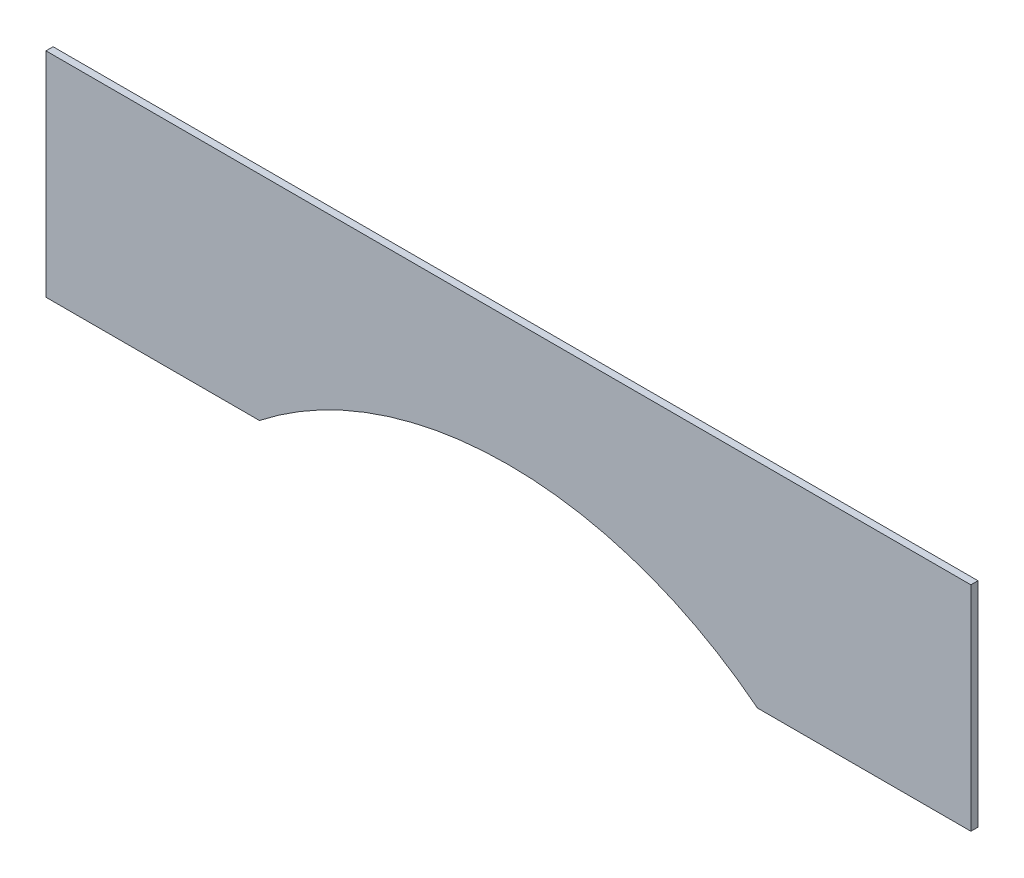
ISO-10303-21;
HEADER;
FILE_DESCRIPTION(('STEP AP214'),'2;1');
FILE_NAME('part.step','',(''),(''),'','','');
FILE_SCHEMA(('AUTOMOTIVE_DESIGN { 1 0 10303 214 1 1 1 1 }'));
ENDSEC;
DATA;
#1=APPLICATION_CONTEXT('core data for automotive mechanical design processes');
#2=APPLICATION_PROTOCOL_DEFINITION('international standard','automotive_design',2000,#1);
#3=PRODUCT_CONTEXT('',#1,'mechanical');
#4=PRODUCT('Part','Part','',(#3));
#5=PRODUCT_RELATED_PRODUCT_CATEGORY('part','',(#4));
#6=PRODUCT_DEFINITION_FORMATION('','',#4);
#7=PRODUCT_DEFINITION_CONTEXT('part definition',#1,'design');
#8=PRODUCT_DEFINITION('design','',#6,#7);
#9=PRODUCT_DEFINITION_SHAPE('','',#8);
#10=(LENGTH_UNIT() NAMED_UNIT(*) SI_UNIT(.MILLI.,.METRE.));
#11=(NAMED_UNIT(*) PLANE_ANGLE_UNIT() SI_UNIT($,.RADIAN.));
#12=(NAMED_UNIT(*) SI_UNIT($,.STERADIAN.) SOLID_ANGLE_UNIT());
#13=UNCERTAINTY_MEASURE_WITH_UNIT(LENGTH_MEASURE(1.E-05),#10,'distance_accuracy_value','');
#14=(GEOMETRIC_REPRESENTATION_CONTEXT(3) GLOBAL_UNCERTAINTY_ASSIGNED_CONTEXT((#13)) GLOBAL_UNIT_ASSIGNED_CONTEXT((#10,
#11,#12)) REPRESENTATION_CONTEXT('',''));
#15=CARTESIAN_POINT('',(0.,0.,0.));
#16=DIRECTION('',(0.,0.,1.));
#17=DIRECTION('',(1.,0.,0.));
#18=AXIS2_PLACEMENT_3D('',#15,#16,#17);
#19=CARTESIAN_POINT('',(330.2,0.,2.54));
#20=DIRECTION('',(-1.,0.,0.));
#21=DIRECTION('',(0.,0.,1.));
#22=AXIS2_PLACEMENT_3D('',#19,#20,#21);
#23=PLANE('',#22);
#24=DIRECTION('',(0.,1.,0.));
#25=VECTOR('',#24,1.);
#26=CARTESIAN_POINT('',(330.2,0.,0.));
#27=LINE('',#26,#25);
#28=CARTESIAN_POINT('',(330.2,0.,0.));
#29=VERTEX_POINT('',#28);
#30=CARTESIAN_POINT('',(330.2,76.2,0.));
#31=VERTEX_POINT('',#30);
#32=EDGE_CURVE('E126',#29,#31,#27,.T.);
#33=ORIENTED_EDGE('',*,*,#32,.T.);
#34=DIRECTION('',(0.,0.,-1.));
#35=VECTOR('',#34,1.);
#36=CARTESIAN_POINT('',(330.2,76.2,2.54));
#37=LINE('',#36,#35);
#38=CARTESIAN_POINT('',(330.2,76.2,2.54));
#39=VERTEX_POINT('',#38);
#40=EDGE_CURVE('E11',#39,#31,#37,.T.);
#41=ORIENTED_EDGE('',*,*,#40,.F.);
#42=DIRECTION('',(0.,1.,0.));
#43=VECTOR('',#42,1.);
#44=CARTESIAN_POINT('',(330.2,0.,2.54));
#45=LINE('',#44,#43);
#46=CARTESIAN_POINT('',(330.2,0.,2.54));
#47=VERTEX_POINT('',#46);
#48=EDGE_CURVE('E88',#47,#39,#45,.T.);
#49=ORIENTED_EDGE('',*,*,#48,.F.);
#50=DIRECTION('',(0.,0.,-1.));
#51=VECTOR('',#50,1.);
#52=CARTESIAN_POINT('',(330.2,0.,2.54));
#53=LINE('',#52,#51);
#54=EDGE_CURVE('E56',#47,#29,#53,.T.);
#55=ORIENTED_EDGE('',*,*,#54,.T.);
#56=EDGE_LOOP('',(#33,#41,#49,#55));
#57=FACE_BOUND('',#56,.T.);
#58=ADVANCED_FACE('F39',(#57),#23,.F.);
#59=CARTESIAN_POINT('',(0.,76.2,2.54));
#60=DIRECTION('',(0.,1.,0.));
#61=DIRECTION('',(0.,0.,1.));
#62=AXIS2_PLACEMENT_3D('',#59,#60,#61);
#63=PLANE('',#62);
#64=DIRECTION('',(1.,0.,0.));
#65=VECTOR('',#64,1.);
#66=CARTESIAN_POINT('',(0.,76.2,0.));
#67=LINE('',#66,#65);
#68=CARTESIAN_POINT('',(0.,76.2,0.));
#69=VERTEX_POINT('',#68);
#70=EDGE_CURVE('E129',#69,#31,#67,.T.);
#71=ORIENTED_EDGE('',*,*,#70,.F.);
#72=DIRECTION('',(0.,0.,-1.));
#73=VECTOR('',#72,1.);
#74=CARTESIAN_POINT('',(0.,76.2,2.54));
#75=LINE('',#74,#73);
#76=CARTESIAN_POINT('',(0.,76.2,2.54));
#77=VERTEX_POINT('',#76);
#78=EDGE_CURVE('E48',#77,#69,#75,.T.);
#79=ORIENTED_EDGE('',*,*,#78,.F.);
#80=DIRECTION('',(1.,0.,0.));
#81=VECTOR('',#80,1.);
#82=CARTESIAN_POINT('',(0.,76.2,2.54));
#83=LINE('',#82,#81);
#84=EDGE_CURVE('E175',#77,#39,#83,.T.);
#85=ORIENTED_EDGE('',*,*,#84,.T.);
#86=ORIENTED_EDGE('',*,*,#40,.T.);
#87=EDGE_LOOP('',(#71,#79,#85,#86));
#88=FACE_BOUND('',#87,.T.);
#89=ADVANCED_FACE('F158',(#88),#63,.T.);
#90=CARTESIAN_POINT('',(0.,0.,2.54));
#91=DIRECTION('',(-1.,0.,0.));
#92=DIRECTION('',(0.,0.,1.));
#93=AXIS2_PLACEMENT_3D('',#90,#91,#92);
#94=PLANE('',#93);
#95=DIRECTION('',(0.,1.,0.));
#96=VECTOR('',#95,1.);
#97=CARTESIAN_POINT('',(0.,0.,0.));
#98=LINE('',#97,#96);
#99=CARTESIAN_POINT('',(0.,0.,0.));
#100=VERTEX_POINT('',#99);
#101=EDGE_CURVE('E133',#100,#69,#98,.T.);
#102=ORIENTED_EDGE('',*,*,#101,.F.);
#103=DIRECTION('',(0.,0.,-1.));
#104=VECTOR('',#103,1.);
#105=CARTESIAN_POINT('',(0.,0.,2.54));
#106=LINE('',#105,#104);
#107=CARTESIAN_POINT('',(0.,0.,2.54));
#108=VERTEX_POINT('',#107);
#109=EDGE_CURVE('E116',#108,#100,#106,.T.);
#110=ORIENTED_EDGE('',*,*,#109,.F.);
#111=DIRECTION('',(0.,1.,0.));
#112=VECTOR('',#111,1.);
#113=CARTESIAN_POINT('',(0.,0.,2.54));
#114=LINE('',#113,#112);
#115=EDGE_CURVE('E104',#108,#77,#114,.T.);
#116=ORIENTED_EDGE('',*,*,#115,.T.);
#117=ORIENTED_EDGE('',*,*,#78,.T.);
#118=EDGE_LOOP('',(#102,#110,#116,#117));
#119=FACE_BOUND('',#118,.T.);
#120=ADVANCED_FACE('F155',(#119),#94,.T.);
#121=CARTESIAN_POINT('',(0.,0.,2.54));
#122=DIRECTION('',(0.,1.,0.));
#123=DIRECTION('',(0.,0.,1.));
#124=AXIS2_PLACEMENT_3D('',#121,#122,#123);
#125=PLANE('',#124);
#126=DIRECTION('',(1.,0.,0.));
#127=VECTOR('',#126,1.);
#128=CARTESIAN_POINT('',(0.,0.,0.));
#129=LINE('',#128,#127);
#130=CARTESIAN_POINT('',(76.2,0.,0.));
#131=VERTEX_POINT('',#130);
#132=EDGE_CURVE('E112',#100,#131,#129,.T.);
#133=ORIENTED_EDGE('',*,*,#132,.T.);
#134=DIRECTION('',(0.,0.,-1.));
#135=VECTOR('',#134,1.);
#136=CARTESIAN_POINT('',(76.2,0.,2.54));
#137=LINE('',#136,#135);
#138=CARTESIAN_POINT('',(76.2,0.,2.54));
#139=VERTEX_POINT('',#138);
#140=EDGE_CURVE('E109',#139,#131,#137,.T.);
#141=ORIENTED_EDGE('',*,*,#140,.F.);
#142=DIRECTION('',(1.,0.,0.));
#143=VECTOR('',#142,1.);
#144=CARTESIAN_POINT('',(0.,0.,2.54));
#145=LINE('',#144,#143);
#146=EDGE_CURVE('E98',#108,#139,#145,.T.);
#147=ORIENTED_EDGE('',*,*,#146,.F.);
#148=ORIENTED_EDGE('',*,*,#109,.T.);
#149=EDGE_LOOP('',(#133,#141,#147,#148));
#150=FACE_BOUND('',#149,.T.);
#151=ADVANCED_FACE('F110',(#150),#125,.F.);
#152=CARTESIAN_POINT('',(165.1,-112.880069099908,2.54));
#153=DIRECTION('',(0.,0.,-1.));
#154=DIRECTION('',(-1.,0.,0.));
#155=AXIS2_PLACEMENT_3D('',#152,#153,#154);
#156=CYLINDRICAL_SURFACE('',#155,143.684097937107);
#157=CARTESIAN_POINT('',(165.1,-112.880069099908,0.));
#158=DIRECTION('',(0.,0.,-1.));
#159=DIRECTION('',(-1.,0.,0.));
#160=AXIS2_PLACEMENT_3D('',#157,#158,#159);
#161=CIRCLE('',#160,143.684097937107);
#162=CARTESIAN_POINT('',(254.,0.,0.));
#163=VERTEX_POINT('',#162);
#164=EDGE_CURVE('E139',#131,#163,#161,.T.);
#165=ORIENTED_EDGE('',*,*,#164,.T.);
#166=DIRECTION('',(0.,0.,-1.));
#167=VECTOR('',#166,1.);
#168=CARTESIAN_POINT('',(254.,0.,2.54));
#169=LINE('',#168,#167);
#170=CARTESIAN_POINT('',(254.,0.,2.54));
#171=VERTEX_POINT('',#170);
#172=EDGE_CURVE('E76',#171,#163,#169,.T.);
#173=ORIENTED_EDGE('',*,*,#172,.F.);
#174=CARTESIAN_POINT('',(165.1,-112.880069099908,2.54));
#175=DIRECTION('',(0.,0.,-1.));
#176=DIRECTION('',(-1.,0.,0.));
#177=AXIS2_PLACEMENT_3D('',#174,#175,#176);
#178=CIRCLE('',#177,143.684097937107);
#179=EDGE_CURVE('E102',#139,#171,#178,.T.);
#180=ORIENTED_EDGE('',*,*,#179,.F.);
#181=ORIENTED_EDGE('',*,*,#140,.T.);
#182=EDGE_LOOP('',(#165,#173,#180,#181));
#183=FACE_BOUND('',#182,.T.);
#184=ADVANCED_FACE('F118',(#183),#156,.F.);
#185=CARTESIAN_POINT('',(330.2,0.,2.54));
#186=DIRECTION('',(0.,-1.,0.));
#187=DIRECTION('',(1.,0.,0.));
#188=AXIS2_PLACEMENT_3D('',#185,#186,#187);
#189=PLANE('',#188);
#190=DIRECTION('',(-1.,0.,0.));
#191=VECTOR('',#190,1.);
#192=CARTESIAN_POINT('',(330.2,0.,0.));
#193=LINE('',#192,#191);
#194=EDGE_CURVE('E142',#29,#163,#193,.T.);
#195=ORIENTED_EDGE('',*,*,#194,.F.);
#196=ORIENTED_EDGE('',*,*,#54,.F.);
#197=DIRECTION('',(-1.,0.,0.));
#198=VECTOR('',#197,1.);
#199=CARTESIAN_POINT('',(330.2,0.,2.54));
#200=LINE('',#199,#198);
#201=EDGE_CURVE('E120',#47,#171,#200,.T.);
#202=ORIENTED_EDGE('',*,*,#201,.T.);
#203=ORIENTED_EDGE('',*,*,#172,.T.);
#204=EDGE_LOOP('',(#195,#196,#202,#203));
#205=FACE_BOUND('',#204,.T.);
#206=ADVANCED_FACE('F161',(#205),#189,.T.);
#207=CARTESIAN_POINT('',(165.1,-112.880069099908,2.54));
#208=DIRECTION('',(0.,0.,-1.));
#209=DIRECTION('',(-1.,0.,0.));
#210=AXIS2_PLACEMENT_3D('',#207,#208,#209);
#211=PLANE('',#210);
#212=ORIENTED_EDGE('',*,*,#48,.T.);
#213=ORIENTED_EDGE('',*,*,#84,.F.);
#214=ORIENTED_EDGE('',*,*,#115,.F.);
#215=ORIENTED_EDGE('',*,*,#146,.T.);
#216=ORIENTED_EDGE('',*,*,#179,.T.);
#217=ORIENTED_EDGE('',*,*,#201,.F.);
#218=EDGE_LOOP('',(#212,#213,#214,#215,#216,#217));
#219=FACE_BOUND('',#218,.T.);
#220=ADVANCED_FACE('F100',(#219),#211,.F.);
#221=CARTESIAN_POINT('',(165.1,-112.880069099908,0.));
#222=DIRECTION('',(0.,0.,-1.));
#223=DIRECTION('',(-1.,0.,0.));
#224=AXIS2_PLACEMENT_3D('',#221,#222,#223);
#225=PLANE('',#224);
#226=ORIENTED_EDGE('',*,*,#32,.F.);
#227=ORIENTED_EDGE('',*,*,#194,.T.);
#228=ORIENTED_EDGE('',*,*,#164,.F.);
#229=ORIENTED_EDGE('',*,*,#132,.F.);
#230=ORIENTED_EDGE('',*,*,#101,.T.);
#231=ORIENTED_EDGE('',*,*,#70,.T.);
#232=EDGE_LOOP('',(#226,#227,#228,#229,#230,#231));
#233=FACE_BOUND('',#232,.T.);
#234=ADVANCED_FACE('F160',(#233),#225,.T.);
#235=CLOSED_SHELL('',(#58,#89,#120,#151,#184,#206,#220,#234));
#236=MANIFOLD_SOLID_BREP('B2',#235);
#237=ADVANCED_BREP_SHAPE_REPRESENTATION('',(#18,#236),#14);
#238=SHAPE_DEFINITION_REPRESENTATION(#9,#237);
ENDSEC;
END-ISO-10303-21;
